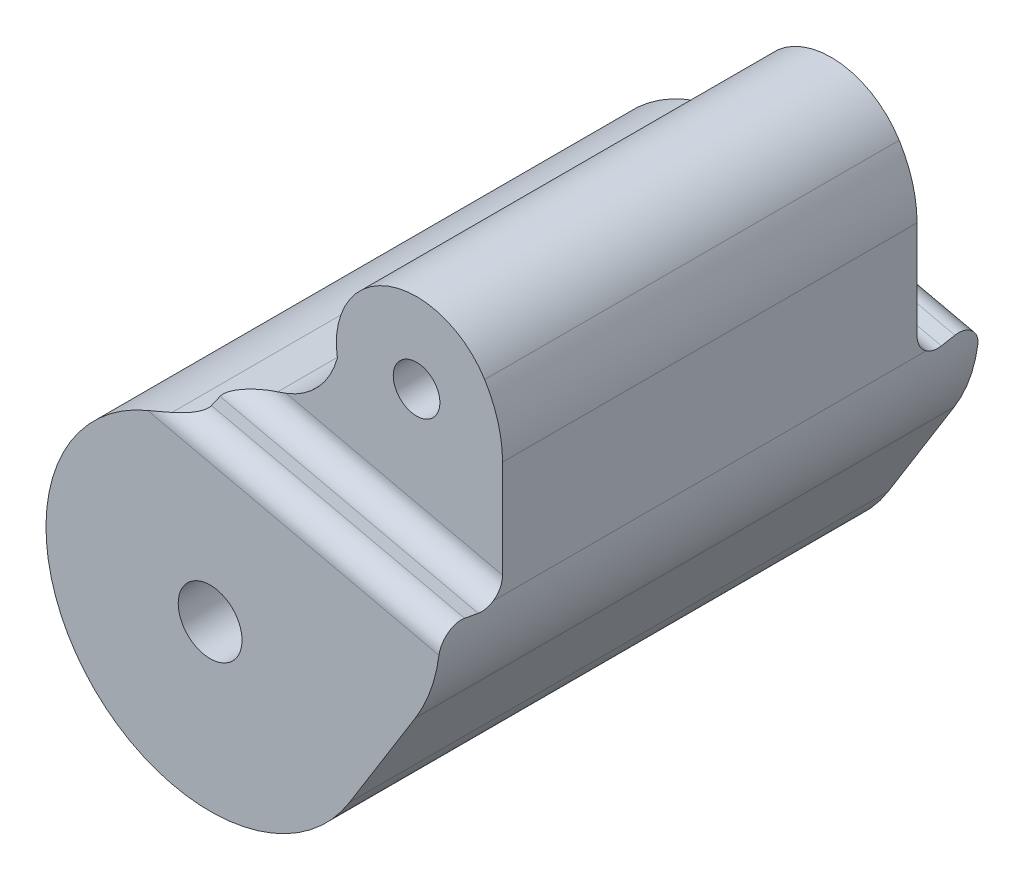
ISO-10303-21;
HEADER;
FILE_DESCRIPTION(('STEP AP214'),'2;1');
FILE_NAME('part.step','',(''),(''),'','','');
FILE_SCHEMA(('AUTOMOTIVE_DESIGN { 1 0 10303 214 1 1 1 1 }'));
ENDSEC;
DATA;
#1=APPLICATION_CONTEXT('core data for automotive mechanical design processes');
#2=APPLICATION_PROTOCOL_DEFINITION('international standard','automotive_design',2000,#1);
#3=PRODUCT_CONTEXT('',#1,'mechanical');
#4=PRODUCT('Part','Part','',(#3));
#5=PRODUCT_RELATED_PRODUCT_CATEGORY('part','',(#4));
#6=PRODUCT_DEFINITION_FORMATION('','',#4);
#7=PRODUCT_DEFINITION_CONTEXT('part definition',#1,'design');
#8=PRODUCT_DEFINITION('design','',#6,#7);
#9=PRODUCT_DEFINITION_SHAPE('','',#8);
#10=(LENGTH_UNIT() NAMED_UNIT(*) SI_UNIT(.MILLI.,.METRE.));
#11=(NAMED_UNIT(*) PLANE_ANGLE_UNIT() SI_UNIT($,.RADIAN.));
#12=(NAMED_UNIT(*) SI_UNIT($,.STERADIAN.) SOLID_ANGLE_UNIT());
#13=UNCERTAINTY_MEASURE_WITH_UNIT(LENGTH_MEASURE(1.E-05),#10,'distance_accuracy_value','');
#14=(GEOMETRIC_REPRESENTATION_CONTEXT(3) GLOBAL_UNCERTAINTY_ASSIGNED_CONTEXT((#13)) GLOBAL_UNIT_ASSIGNED_CONTEXT((#10,
#11,#12)) REPRESENTATION_CONTEXT('',''));
#15=CARTESIAN_POINT('',(0.,0.,0.));
#16=DIRECTION('',(0.,0.,1.));
#17=DIRECTION('',(1.,0.,0.));
#18=AXIS2_PLACEMENT_3D('',#15,#16,#17);
#19=CARTESIAN_POINT('',(-3.8486651097793,6.9931639949653,13.));
#20=DIRECTION('',(0.,0.,-1.));
#21=DIRECTION('',(-1.,0.,0.));
#22=AXIS2_PLACEMENT_3D('',#19,#20,#21);
#23=CYLINDRICAL_SURFACE('',#22,4.02);
#24=CARTESIAN_POINT('',(-3.8486651097793,6.9931639949653,-10.));
#25=DIRECTION('',(0.,0.,-1.));
#26=DIRECTION('',(-1.,0.,0.));
#27=AXIS2_PLACEMENT_3D('',#24,#25,#26);
#28=CIRCLE('',#27,4.02);
#29=CARTESIAN_POINT('',(-2.43806543387227,3.2287771186824,-10.));
#30=VERTEX_POINT('',#29);
#31=CARTESIAN_POINT('',(0.0298023679556354,5.93586081037142,-10.));
#32=VERTEX_POINT('',#31);
#33=EDGE_CURVE('E327',#30,#32,#28,.F.);
#34=ORIENTED_EDGE('',*,*,#33,.F.);
#35=CARTESIAN_POINT('',(-2.43806543387227,3.2287771186824,-10.));
#36=CARTESIAN_POINT('',(-2.47026750834435,3.21670977135976,-10.000001288007));
#37=CARTESIAN_POINT('',(-2.5026214386757,3.20505775667663,-10.000536638408));
#38=CARTESIAN_POINT('',(-2.56755065455409,3.18260981290413,-10.0025585404461));
#39=CARTESIAN_POINT('',(-2.6001256123034,3.17181283040766,-10.0040439005098));
#40=CARTESIAN_POINT('',(-2.66549406462945,3.15107051387799,-10.0078494063288));
#41=CARTESIAN_POINT('',(-2.69828755050749,3.14112514616125,-10.0101695190486));
#42=CARTESIAN_POINT('',(-2.76410428106637,3.12207844976408,-10.0155426969425));
#43=CARTESIAN_POINT('',(-2.79712776215765,3.11297819433025,-10.0185966769065));
#44=CARTESIAN_POINT('',(-2.83023006291763,3.10430940070186,-10.0219635643167));
#45=B_SPLINE_CURVE_WITH_KNOTS('',3,(#35,#36,#37,#38,#39,#40,#41,#42,#43,#44),.UNSPECIFIED.,.F.,
.F.,(4,2,2,2,4),(0.,0.103154592673073,0.206180054192997,0.309201438908278,0.412351915509261),.UNSPECIFIED.);
#46=CARTESIAN_POINT('',(-2.83023006291763,3.10430940070187,-10.0219635643167));
#47=VERTEX_POINT('',#46);
#48=EDGE_CURVE('E280',#30,#47,#45,.T.);
#49=ORIENTED_EDGE('',*,*,#48,.T.);
#50=DIRECTION('',(0.,0.,-1.));
#51=VECTOR('',#50,1.);
#52=CARTESIAN_POINT('',(-2.83023006291763,3.10430940070187,13.));
#53=LINE('',#52,#51);
#54=CARTESIAN_POINT('',(-2.83023006291763,3.10430940070187,10.0219635643167));
#55=VERTEX_POINT('',#54);
#56=EDGE_CURVE('E64',#55,#47,#53,.T.);
#57=ORIENTED_EDGE('',*,*,#56,.F.);
#58=CARTESIAN_POINT('',(-2.83023006291763,3.10430940070187,10.0219635643167));
#59=CARTESIAN_POINT('',(-2.79712776215765,3.11297819433025,10.0185966769065));
#60=CARTESIAN_POINT('',(-2.76410428106637,3.12207844976408,10.0155426969425));
#61=CARTESIAN_POINT('',(-2.69828755050749,3.14112514616125,10.0101695190486));
#62=CARTESIAN_POINT('',(-2.66549406462945,3.15107051387799,10.0078494063288));
#63=CARTESIAN_POINT('',(-2.6001256123034,3.17181283040766,10.0040439005098));
#64=CARTESIAN_POINT('',(-2.56755065455409,3.18260981290413,10.0025585404461));
#65=CARTESIAN_POINT('',(-2.5026214386757,3.20505775667663,10.000536638408));
#66=CARTESIAN_POINT('',(-2.47026750834435,3.21670977135976,10.000001288007));
#67=CARTESIAN_POINT('',(-2.43806543387227,3.2287771186824,10.));
#68=B_SPLINE_CURVE_WITH_KNOTS('',3,(#58,#59,#60,#61,#62,#63,#64,#65,#66,#67),.UNSPECIFIED.,.F.,
.F.,(4,2,2,2,4),(0.,0.103150476600983,0.206171861316264,0.309197322836187,0.41235191550926),.UNSPECIFIED.);
#69=CARTESIAN_POINT('',(-2.43806543387227,3.2287771186824,10.));
#70=VERTEX_POINT('',#69);
#71=EDGE_CURVE('E11',#55,#70,#68,.T.);
#72=ORIENTED_EDGE('',*,*,#71,.T.);
#73=CARTESIAN_POINT('',(-3.8486651097793,6.9931639949653,10.));
#74=DIRECTION('',(0.,0.,1.));
#75=DIRECTION('',(1.,0.,0.));
#76=AXIS2_PLACEMENT_3D('',#73,#74,#75);
#77=CIRCLE('',#76,4.02);
#78=CARTESIAN_POINT('',(0.0298023679556354,5.93586081037142,10.));
#79=VERTEX_POINT('',#78);
#80=EDGE_CURVE('E364',#79,#70,#77,.F.);
#81=ORIENTED_EDGE('',*,*,#80,.F.);
#82=DIRECTION('',(0.,0.,-1.));
#83=VECTOR('',#82,1.);
#84=CARTESIAN_POINT('',(0.0298023679556354,5.93586081037142,13.));
#85=LINE('',#84,#83);
#86=EDGE_CURVE('E195',#79,#32,#85,.T.);
#87=ORIENTED_EDGE('',*,*,#86,.T.);
#88=EDGE_LOOP('',(#34,#49,#57,#72,#81,#87));
#89=FACE_BOUND('',#88,.T.);
#90=ADVANCED_FACE('F43',(#89),#23,.F.);
#91=CARTESIAN_POINT('',(8.,5.57,13.));
#92=DIRECTION('',(-1.,0.,0.));
#93=DIRECTION('',(0.,-1.,0.));
#94=AXIS2_PLACEMENT_3D('',#91,#92,#93);
#95=PLANE('',#94);
#96=DIRECTION('',(0.,-1.,0.));
#97=VECTOR('',#96,1.);
#98=CARTESIAN_POINT('',(8.,5.57,-10.));
#99=LINE('',#98,#97);
#100=CARTESIAN_POINT('',(8.,5.57,-10.));
#101=VERTEX_POINT('',#100);
#102=CARTESIAN_POINT('',(8.,0.851864193884391,-10.));
#103=VERTEX_POINT('',#102);
#104=EDGE_CURVE('E165',#101,#103,#99,.T.);
#105=ORIENTED_EDGE('',*,*,#104,.F.);
#106=DIRECTION('',(0.,0.,-1.));
#107=VECTOR('',#106,1.);
#108=CARTESIAN_POINT('',(8.,5.57,13.));
#109=LINE('',#108,#107);
#110=CARTESIAN_POINT('',(8.,5.57,10.));
#111=VERTEX_POINT('',#110);
#112=EDGE_CURVE('E179',#111,#101,#109,.T.);
#113=ORIENTED_EDGE('',*,*,#112,.F.);
#114=DIRECTION('',(0.,1.,0.));
#115=VECTOR('',#114,1.);
#116=CARTESIAN_POINT('',(8.,5.57,10.));
#117=LINE('',#116,#115);
#118=CARTESIAN_POINT('',(8.,0.85186419388439,10.));
#119=VERTEX_POINT('',#118);
#120=EDGE_CURVE('E369',#119,#111,#117,.T.);
#121=ORIENTED_EDGE('',*,*,#120,.F.);
#122=CARTESIAN_POINT('',(8.,0.85186419388439,11.));
#123=DIRECTION('',(-1.,0.,0.));
#124=DIRECTION('',(0.,-1.,0.));
#125=AXIS2_PLACEMENT_3D('',#122,#123,#124);
#126=ELLIPSE('',#125,1.02559958442035,1.);
#127=CARTESIAN_POINT('',(8.,0.,10.4431322147712));
#128=VERTEX_POINT('',#127);
#129=EDGE_CURVE('E345',#119,#128,#126,.T.);
#130=ORIENTED_EDGE('',*,*,#129,.T.);
#131=DIRECTION('',(0.,0.,-1.));
#132=VECTOR('',#131,1.);
#133=CARTESIAN_POINT('',(8.,0.,13.));
#134=LINE('',#133,#132);
#135=CARTESIAN_POINT('',(8.,0.,-10.4431322147712));
#136=VERTEX_POINT('',#135);
#137=EDGE_CURVE('E72',#128,#136,#134,.T.);
#138=ORIENTED_EDGE('',*,*,#137,.T.);
#139=CARTESIAN_POINT('',(8.,0.851864193884391,-11.));
#140=DIRECTION('',(-1.,0.,0.));
#141=DIRECTION('',(0.,-1.,0.));
#142=AXIS2_PLACEMENT_3D('',#139,#140,#141);
#143=ELLIPSE('',#142,1.02559958442035,1.);
#144=EDGE_CURVE('E181',#136,#103,#143,.T.);
#145=ORIENTED_EDGE('',*,*,#144,.T.);
#146=EDGE_LOOP('',(#105,#113,#121,#130,#138,#145));
#147=FACE_BOUND('',#146,.T.);
#148=ADVANCED_FACE('F177',(#147),#95,.F.);
#149=CARTESIAN_POINT('',(2.28,5.57,13.));
#150=DIRECTION('',(0.,0.,-1.));
#151=DIRECTION('',(-1.,0.,0.));
#152=AXIS2_PLACEMENT_3D('',#149,#150,#151);
#153=CYLINDRICAL_SURFACE('',#152,5.72);
#154=CARTESIAN_POINT('',(2.28,5.57,-10.));
#155=DIRECTION('',(0.,0.,-1.));
#156=DIRECTION('',(-1.,0.,0.));
#157=AXIS2_PLACEMENT_3D('',#154,#155,#156);
#158=CIRCLE('',#157,5.72);
#159=CARTESIAN_POINT('',(7.1383976065202,8.58900193722342,-10.));
#160=VERTEX_POINT('',#159);
#161=EDGE_CURVE('E162',#160,#101,#158,.T.);
#162=ORIENTED_EDGE('',*,*,#161,.F.);
#163=DIRECTION('',(0.,0.,-1.));
#164=VECTOR('',#163,1.);
#165=CARTESIAN_POINT('',(7.1383976065202,8.58900193722342,13.));
#166=LINE('',#165,#164);
#167=CARTESIAN_POINT('',(7.1383976065202,8.58900193722342,10.));
#168=VERTEX_POINT('',#167);
#169=EDGE_CURVE('E189',#168,#160,#166,.T.);
#170=ORIENTED_EDGE('',*,*,#169,.F.);
#171=CARTESIAN_POINT('',(2.28,5.57,10.));
#172=DIRECTION('',(0.,0.,1.));
#173=DIRECTION('',(1.,0.,0.));
#174=AXIS2_PLACEMENT_3D('',#171,#172,#173);
#175=CIRCLE('',#174,5.72);
#176=EDGE_CURVE('E187',#111,#168,#175,.T.);
#177=ORIENTED_EDGE('',*,*,#176,.F.);
#178=ORIENTED_EDGE('',*,*,#112,.T.);
#179=EDGE_LOOP('',(#162,#170,#177,#178));
#180=FACE_BOUND('',#179,.T.);
#181=ADVANCED_FACE('F186',(#180),#153,.T.);
#182=CARTESIAN_POINT('',(3.8513348902207,6.54642545172436,13.));
#183=DIRECTION('',(0.,0.,-1.));
#184=DIRECTION('',(-1.,0.,0.));
#185=AXIS2_PLACEMENT_3D('',#182,#183,#184);
#186=CYLINDRICAL_SURFACE('',#185,3.87);
#187=CARTESIAN_POINT('',(3.8513348902207,6.54642545172436,-10.));
#188=DIRECTION('',(0.,0.,-1.));
#189=DIRECTION('',(-1.,0.,0.));
#190=AXIS2_PLACEMENT_3D('',#187,#188,#189);
#191=CIRCLE('',#190,3.87);
#192=EDGE_CURVE('E168',#32,#160,#191,.T.);
#193=ORIENTED_EDGE('',*,*,#192,.F.);
#194=ORIENTED_EDGE('',*,*,#86,.F.);
#195=CARTESIAN_POINT('',(3.8513348902207,6.54642545172436,10.));
#196=DIRECTION('',(0.,0.,1.));
#197=DIRECTION('',(1.,0.,0.));
#198=AXIS2_PLACEMENT_3D('',#195,#196,#197);
#199=CIRCLE('',#198,3.87);
#200=EDGE_CURVE('E216',#168,#79,#199,.T.);
#201=ORIENTED_EDGE('',*,*,#200,.F.);
#202=ORIENTED_EDGE('',*,*,#169,.T.);
#203=EDGE_LOOP('',(#193,#194,#201,#202));
#204=FACE_BOUND('',#203,.T.);
#205=ADVANCED_FACE('F445',(#204),#186,.T.);
#206=CARTESIAN_POINT('',(3.8513348902207,6.54642545172436,13.));
#207=DIRECTION('',(0.,0.,-1.));
#208=DIRECTION('',(-1.,0.,0.));
#209=AXIS2_PLACEMENT_3D('',#206,#207,#208);
#210=CYLINDRICAL_SURFACE('',#209,1.12500000000001);
#211=CARTESIAN_POINT('',(3.8513348902207,6.54642545172436,10.));
#212=DIRECTION('',(0.,0.,1.));
#213=DIRECTION('',(1.,0.,0.));
#214=AXIS2_PLACEMENT_3D('',#211,#212,#213);
#215=CIRCLE('',#214,1.12500000000001);
#216=CARTESIAN_POINT('',(2.72633489022069,6.54642545172436,10.));
#217=VERTEX_POINT('',#216);
#218=EDGE_CURVE('E212',#217,#217,#215,.T.);
#219=CARTESIAN_POINT('',(3.8513348902207,6.54642545172436,-10.));
#220=DIRECTION('',(0.,0.,-1.));
#221=DIRECTION('',(-1.,0.,0.));
#222=AXIS2_PLACEMENT_3D('',#219,#220,#221);
#223=CIRCLE('',#222,1.12500000000001);
#224=CARTESIAN_POINT('',(2.72633489022069,6.54642545172436,-10.));
#225=VERTEX_POINT('',#224);
#226=EDGE_CURVE('E217',#225,#225,#223,.T.);
#227=CARTESIAN_POINT('',(2.72633489022069,6.54642545172436,10.));
#228=CARTESIAN_POINT('',(2.72633489022069,6.54642545172436,9.79166666666666));
#229=CARTESIAN_POINT('',(2.72633489022069,6.54642545172436,9.58333333333333));
#230=CARTESIAN_POINT('',(2.72633489022069,6.54642545172436,9.16666666666666));
#231=CARTESIAN_POINT('',(2.72633489022069,6.54642545172436,8.95833333333333));
#232=CARTESIAN_POINT('',(2.72633489022069,6.54642545172436,8.54166666666666));
#233=CARTESIAN_POINT('',(2.72633489022069,6.54642545172436,8.33333333333333));
#234=CARTESIAN_POINT('',(2.72633489022069,6.54642545172436,7.91666666666666));
#235=CARTESIAN_POINT('',(2.72633489022069,6.54642545172436,7.70833333333333));
#236=CARTESIAN_POINT('',(2.72633489022069,6.54642545172436,7.29166666666667));
#237=CARTESIAN_POINT('',(2.72633489022069,6.54642545172436,7.08333333333333));
#238=CARTESIAN_POINT('',(2.72633489022069,6.54642545172436,6.66666666666666));
#239=CARTESIAN_POINT('',(2.72633489022069,6.54642545172436,6.45833333333333));
#240=CARTESIAN_POINT('',(2.72633489022069,6.54642545172436,6.04166666666667));
#241=CARTESIAN_POINT('',(2.72633489022069,6.54642545172436,5.83333333333333));
#242=CARTESIAN_POINT('',(2.72633489022069,6.54642545172436,5.41666666666667));
#243=CARTESIAN_POINT('',(2.72633489022069,6.54642545172436,5.20833333333333));
#244=CARTESIAN_POINT('',(2.72633489022069,6.54642545172436,4.79166666666667));
#245=CARTESIAN_POINT('',(2.72633489022069,6.54642545172436,4.58333333333333));
#246=CARTESIAN_POINT('',(2.72633489022069,6.54642545172436,4.16666666666667));
#247=CARTESIAN_POINT('',(2.72633489022069,6.54642545172436,3.95833333333333));
#248=CARTESIAN_POINT('',(2.72633489022069,6.54642545172436,3.54166666666667));
#249=CARTESIAN_POINT('',(2.72633489022069,6.54642545172436,3.33333333333333));
#250=CARTESIAN_POINT('',(2.72633489022069,6.54642545172436,2.91666666666667));
#251=CARTESIAN_POINT('',(2.72633489022069,6.54642545172436,2.70833333333333));
#252=CARTESIAN_POINT('',(2.72633489022069,6.54642545172436,2.29166666666667));
#253=CARTESIAN_POINT('',(2.72633489022069,6.54642545172436,2.08333333333333));
#254=CARTESIAN_POINT('',(2.72633489022069,6.54642545172436,1.66666666666667));
#255=CARTESIAN_POINT('',(2.72633489022069,6.54642545172436,1.45833333333333));
#256=CARTESIAN_POINT('',(2.72633489022069,6.54642545172436,1.04166666666667));
#257=CARTESIAN_POINT('',(2.72633489022069,6.54642545172436,0.833333333333333));
#258=CARTESIAN_POINT('',(2.72633489022069,6.54642545172436,0.416666666666667));
#259=CARTESIAN_POINT('',(2.72633489022069,6.54642545172436,0.208333333333333));
#260=CARTESIAN_POINT('',(2.72633489022069,6.54642545172436,-0.208333333333333));
#261=CARTESIAN_POINT('',(2.72633489022069,6.54642545172436,-0.416666666666667));
#262=CARTESIAN_POINT('',(2.72633489022069,6.54642545172436,-0.833333333333333));
#263=CARTESIAN_POINT('',(2.72633489022069,6.54642545172436,-1.04166666666667));
#264=CARTESIAN_POINT('',(2.72633489022069,6.54642545172436,-1.45833333333333));
#265=CARTESIAN_POINT('',(2.72633489022069,6.54642545172436,-1.66666666666667));
#266=CARTESIAN_POINT('',(2.72633489022069,6.54642545172436,-2.08333333333333));
#267=CARTESIAN_POINT('',(2.72633489022069,6.54642545172436,-2.29166666666667));
#268=CARTESIAN_POINT('',(2.72633489022069,6.54642545172436,-2.70833333333333));
#269=CARTESIAN_POINT('',(2.72633489022069,6.54642545172436,-2.91666666666666));
#270=CARTESIAN_POINT('',(2.72633489022069,6.54642545172436,-3.33333333333333));
#271=CARTESIAN_POINT('',(2.72633489022069,6.54642545172436,-3.54166666666666));
#272=CARTESIAN_POINT('',(2.72633489022069,6.54642545172436,-3.95833333333333));
#273=CARTESIAN_POINT('',(2.72633489022069,6.54642545172436,-4.16666666666667));
#274=CARTESIAN_POINT('',(2.72633489022069,6.54642545172436,-4.58333333333333));
#275=CARTESIAN_POINT('',(2.72633489022069,6.54642545172436,-4.79166666666667));
#276=CARTESIAN_POINT('',(2.72633489022069,6.54642545172436,-5.20833333333333));
#277=CARTESIAN_POINT('',(2.72633489022069,6.54642545172436,-5.41666666666667));
#278=CARTESIAN_POINT('',(2.72633489022069,6.54642545172436,-5.83333333333333));
#279=CARTESIAN_POINT('',(2.72633489022069,6.54642545172436,-6.04166666666667));
#280=CARTESIAN_POINT('',(2.72633489022069,6.54642545172436,-6.45833333333333));
#281=CARTESIAN_POINT('',(2.72633489022069,6.54642545172436,-6.66666666666666));
#282=CARTESIAN_POINT('',(2.72633489022069,6.54642545172436,-7.08333333333333));
#283=CARTESIAN_POINT('',(2.72633489022069,6.54642545172436,-7.29166666666666));
#284=CARTESIAN_POINT('',(2.72633489022069,6.54642545172436,-7.70833333333333));
#285=CARTESIAN_POINT('',(2.72633489022069,6.54642545172436,-7.91666666666667));
#286=CARTESIAN_POINT('',(2.72633489022069,6.54642545172436,-8.33333333333333));
#287=CARTESIAN_POINT('',(2.72633489022069,6.54642545172436,-8.54166666666666));
#288=CARTESIAN_POINT('',(2.72633489022069,6.54642545172436,-8.95833333333333));
#289=CARTESIAN_POINT('',(2.72633489022069,6.54642545172436,-9.16666666666666));
#290=CARTESIAN_POINT('',(2.72633489022069,6.54642545172436,-9.58333333333333));
#291=CARTESIAN_POINT('',(2.72633489022069,6.54642545172436,-9.79166666666666));
#292=CARTESIAN_POINT('',(2.72633489022069,6.54642545172436,-10.));
#293=B_SPLINE_CURVE_WITH_KNOTS('',3,(#227,#228,#229,#230,#231,#232,#233,#234,#235,#236,#237,
#238,#239,#240,#241,#242,#243,#244,#245,#246,#247,#248,#249,#250,#251,#252,#253,#254,#255,#256,
#257,#258,#259,#260,#261,#262,#263,#264,#265,#266,#267,#268,#269,#270,#271,#272,#273,#274,#275,
#276,#277,#278,#279,#280,#281,#282,#283,#284,#285,#286,#287,#288,#289,#290,#291,#292),
.UNSPECIFIED.,.F.,.F.,(4,2,2,2,2,2,2,2,2,2,2,2,2,2,2,2,2,2,2,2,2,2,2,2,2,2,2,2,2,2,2,2,4),(0.,
0.624999999999999,1.25,1.875,2.5,3.125,3.75,4.375,5.,5.625,6.25,6.875,7.5,8.125,8.75,9.375,10.,
10.625,11.25,11.875,12.5,13.125,13.75,14.375,15.,15.625,16.25,16.875,17.5,18.125,18.75,19.375,
20.),.UNSPECIFIED.);
#294=EDGE_CURVE('BSEAM471',#217,#225,#293,.T.);
#295=ORIENTED_EDGE('',*,*,#218,.T.);
#296=ORIENTED_EDGE('',*,*,#226,.T.);
#297=ORIENTED_EDGE('',*,*,#294,.T.);
#298=ORIENTED_EDGE('',*,*,#294,.F.);
#299=EDGE_LOOP('',(#295,#297,#296,#298));
#300=FACE_BOUND('',#299,.T.);
#301=ADVANCED_FACE('F471',(#300),#210,.F.);
#302=CARTESIAN_POINT('',(-3.8486651097793,6.9931639949653,-13.));
#303=DIRECTION('',(0.,0.,-1.));
#304=DIRECTION('',(-1.,0.,0.));
#305=AXIS2_PLACEMENT_3D('',#302,#303,#304);
#306=PLANE('',#305);
#307=CARTESIAN_POINT('',(-3.10886455277903,-5.15575030354206,-13.));
#308=DIRECTION('',(0.,0.,1.));
#309=DIRECTION('',(1.,0.,0.));
#310=AXIS2_PLACEMENT_3D('',#307,#308,#309);
#311=CIRCLE('',#310,1.54);
#312=CARTESIAN_POINT('',(-4.64886455277903,-5.15575030354206,-13.));
#313=VERTEX_POINT('',#312);
#314=EDGE_CURVE('E379',#313,#313,#311,.T.);
#315=ORIENTED_EDGE('',*,*,#314,.T.);
#316=EDGE_LOOP('',(#315));
#317=FACE_BOUND('',#316,.T.);
#318=CARTESIAN_POINT('',(-3.10886455277903,-5.15575030354206,-13.));
#319=DIRECTION('',(0.,0.,1.));
#320=DIRECTION('',(-1.,0.,0.));
#321=AXIS2_PLACEMENT_3D('',#318,#319,#320);
#322=CIRCLE('',#321,7.92);
#323=CARTESIAN_POINT('',(-6.12672761900291,2.1667426130487,-13.));
#324=VERTEX_POINT('',#323);
#325=CARTESIAN_POINT('',(3.61857479888122,-9.33521914177175,-13.));
#326=VERTEX_POINT('',#325);
#327=EDGE_CURVE('E384',#324,#326,#322,.T.);
#328=ORIENTED_EDGE('',*,*,#327,.F.);
#329=DIRECTION('',(-0.975039396652237,0.222031923326446,0.));
#330=VECTOR('',#329,1.);
#331=CARTESIAN_POINT('',(-5.00584078384651,1.91149891654211,-13.));
#332=LINE('',#331,#330);
#333=CARTESIAN_POINT('',(7.93278784449341,-1.03483187729098,-13.));
#334=VERTEX_POINT('',#333);
#335=EDGE_CURVE('E220',#324,#334,#332,.F.);
#336=ORIENTED_EDGE('',*,*,#335,.T.);
#337=CARTESIAN_POINT('',(0.,0.,-13.));
#338=DIRECTION('',(0.,0.,1.));
#339=DIRECTION('',(-1.,0.,0.));
#340=AXIS2_PLACEMENT_3D('',#337,#338,#339);
#341=CIRCLE('',#340,8.);
#342=CARTESIAN_POINT('',(6.79539328450531,-4.22168569518151,-13.));
#343=VERTEX_POINT('',#342);
#344=EDGE_CURVE('E392',#343,#334,#341,.T.);
#345=ORIENTED_EDGE('',*,*,#344,.F.);
#346=DIRECTION('',(0.527710711897689,0.849424160563163,0.));
#347=VECTOR('',#346,1.);
#348=CARTESIAN_POINT('',(6.79539328450531,-4.22168569518151,-13.));
#349=LINE('',#348,#347);
#350=EDGE_CURVE('E401',#326,#343,#349,.T.);
#351=ORIENTED_EDGE('',*,*,#350,.F.);
#352=EDGE_LOOP('',(#328,#336,#345,#351));
#353=FACE_BOUND('',#352,.T.);
#354=ADVANCED_FACE('F294',(#317,#353),#306,.T.);
#355=CARTESIAN_POINT('',(-5.11533360032743,2.50587367321576,13.));
#356=DIRECTION('',(0.253342051458129,-0.967376764742149,0.));
#357=DIRECTION('',(0.967376764742149,0.253342051458129,0.));
#358=AXIS2_PLACEMENT_3D('',#355,#356,#357);
#359=PLANE('',#358);
#360=DIRECTION('',(0.,0.,-1.));
#361=VECTOR('',#360,1.);
#362=CARTESIAN_POINT('',(-5.11533360032743,2.50587367321576,13.));
#363=LINE('',#362,#361);
#364=CARTESIAN_POINT('',(-5.11533360032743,2.50587367321576,12.8316982476695));
#365=VERTEX_POINT('',#364);
#366=CARTESIAN_POINT('',(-5.11533360032743,2.50587367321576,-12.8316982476695));
#367=VERTEX_POINT('',#366);
#368=EDGE_CURVE('E206',#365,#367,#363,.T.);
#369=ORIENTED_EDGE('',*,*,#368,.F.);
#370=CARTESIAN_POINT('',(-6.27840511627298,2.20128198300631,12.));
#371=DIRECTION('',(0.253342051458129,-0.967376764742149,0.));
#372=DIRECTION('',(0.967376764742149,0.253342051458129,0.));
#373=AXIS2_PLACEMENT_3D('',#370,#371,#372);
#374=ELLIPSE('',#373,2.16540673899456,1.);
#375=CARTESIAN_POINT('',(-4.21546512533732,2.74153627521887,11.8263518223331));
#376=VERTEX_POINT('',#375);
#377=EDGE_CURVE('E315',#365,#376,#374,.F.);
#378=ORIENTED_EDGE('',*,*,#377,.T.);
#379=DIRECTION('',(-0.34506595060457,-0.0903678060097014,-0.934217934622515));
#380=VECTOR('',#379,1.);
#381=CARTESIAN_POINT('',(-3.95161634908844,2.81063447220464,12.5406855848154));
#382=LINE('',#381,#380);
#383=CARTESIAN_POINT('',(-4.45654998922488,2.67839961924486,11.1736481776669));
#384=VERTEX_POINT('',#383);
#385=EDGE_CURVE('E361',#376,#384,#382,.T.);
#386=ORIENTED_EDGE('',*,*,#385,.T.);
#387=CARTESIAN_POINT('',(-2.39360999828923,3.21865391145743,11.));
#388=DIRECTION('',(0.253342051458129,-0.967376764742149,0.));
#389=DIRECTION('',(0.967376764742149,0.253342051458129,0.));
#390=AXIS2_PLACEMENT_3D('',#387,#388,#389);
#391=ELLIPSE('',#390,2.16540673899456,1.);
#392=EDGE_CURVE('E58',#384,#55,#391,.T.);
#393=ORIENTED_EDGE('',*,*,#392,.T.);
#394=ORIENTED_EDGE('',*,*,#56,.T.);
#395=CARTESIAN_POINT('',(-2.39360999828923,3.21865391145743,-11.));
#396=DIRECTION('',(0.253342051458129,-0.967376764742149,0.));
#397=DIRECTION('',(0.967376764742149,0.253342051458129,0.));
#398=AXIS2_PLACEMENT_3D('',#395,#396,#397);
#399=ELLIPSE('',#398,2.16540673899456,1.);
#400=CARTESIAN_POINT('',(-4.45654998922488,2.67839961924486,-11.1736481776669));
#401=VERTEX_POINT('',#400);
#402=EDGE_CURVE('E287',#47,#401,#399,.T.);
#403=ORIENTED_EDGE('',*,*,#402,.T.);
#404=DIRECTION('',(0.34506595060457,0.0903678060097014,-0.934217934622515));
#405=VECTOR('',#404,1.);
#406=CARTESIAN_POINT('',(-12.3331531408297,0.615630619949107,10.1511562988139));
#407=LINE('',#406,#405);
#408=CARTESIAN_POINT('',(-4.21546512533732,2.74153627521887,-11.8263518223331));
#409=VERTEX_POINT('',#408);
#410=EDGE_CURVE('E183',#409,#401,#407,.F.);
#411=ORIENTED_EDGE('',*,*,#410,.F.);
#412=CARTESIAN_POINT('',(-6.27840511627298,2.20128198300631,-12.));
#413=DIRECTION('',(0.253342051458129,-0.967376764742149,0.));
#414=DIRECTION('',(-0.967376764742149,-0.253342051458129,0.));
#415=AXIS2_PLACEMENT_3D('',#412,#413,#414);
#416=ELLIPSE('',#415,2.16540673899456,1.);
#417=EDGE_CURVE('E419',#409,#367,#416,.F.);
#418=ORIENTED_EDGE('',*,*,#417,.T.);
#419=EDGE_LOOP('',(#369,#378,#386,#393,#394,#403,#411,#418));
#420=FACE_BOUND('',#419,.T.);
#421=ADVANCED_FACE('F245',(#420),#359,.F.);
#422=CARTESIAN_POINT('',(0.,0.,13.));
#423=DIRECTION('',(0.,0.,-1.));
#424=DIRECTION('',(-1.,0.,0.));
#425=AXIS2_PLACEMENT_3D('',#422,#423,#424);
#426=CYLINDRICAL_SURFACE('',#425,8.);
#427=ORIENTED_EDGE('',*,*,#137,.F.);
#428=CARTESIAN_POINT('',(8.,0.,10.4431322147712));
#429=CARTESIAN_POINT('',(7.99999972168051,-0.0156621425541701,10.4659102767497));
#430=CARTESIAN_POINT('',(7.99995406640041,-0.0303634518808904,10.489333177973));
#431=CARTESIAN_POINT('',(7.99980329324114,-0.057752575958232,10.5373285943015));
#432=CARTESIAN_POINT('',(7.99969817362192,-0.0704403317739717,10.5619011430286));
#433=CARTESIAN_POINT('',(7.99934056316604,-0.10534424368915,10.6371311311712));
#434=CARTESIAN_POINT('',(7.99904582083767,-0.124401017414187,10.6893008734877));
#435=CARTESIAN_POINT('',(7.99854121839214,-0.153463922503186,10.7961147739615));
#436=CARTESIAN_POINT('',(7.99833143226417,-0.163462174047052,10.8507610431));
#437=CARTESIAN_POINT('',(7.99810768839357,-0.174081078785524,10.960884401148));
#438=CARTESIAN_POINT('',(7.99809330474073,-0.17472212769288,11.016359419162));
#439=CARTESIAN_POINT('',(7.99820516899084,-0.169449405365699,11.0885684222151));
#440=CARTESIAN_POINT('',(7.9982414132491,-0.167744615392987,11.10567955388));
#441=CARTESIAN_POINT('',(7.99833061059263,-0.163440365491603,11.1397672841778));
#442=CARTESIAN_POINT('',(7.99838354283989,-0.16084202096443,11.1567440236685));
#443=CARTESIAN_POINT('',(7.99844355003619,-0.157799800015032,11.1736481776669));
#444=B_SPLINE_CURVE_WITH_KNOTS('',3,(#428,#429,#430,#431,#432,#433,#434,#435,#436,#437,#438,
#439,#440,#441,#442,#443),.UNSPECIFIED.,.F.,.F.,(4,2,2,2,2,2,2,4),(0.,0.0828788864387145,
0.165760198219911,0.331522962169218,0.497429781642022,0.662974923110118,0.71454616162651,
0.766053257349152),.UNSPECIFIED.);
#445=CARTESIAN_POINT('',(7.99844355003617,-0.157799800015026,11.1736481776669));
#446=VERTEX_POINT('',#445);
#447=EDGE_CURVE('E349',#128,#446,#444,.T.);
#448=ORIENTED_EDGE('',*,*,#447,.T.);
#449=CARTESIAN_POINT('',(0.,0.,1.97455240277872));
#450=DIRECTION('',(-0.218658759508096,-0.960226357315469,0.173648177666931));
#451=DIRECTION('',(-0.038555438869521,-0.169313814382125,-0.984807753012208));
#452=AXIS2_PLACEMENT_3D('',#449,#450,#451);
#453=ELLIPSE('',#452,46.070163865149,8.);
#454=CARTESIAN_POINT('',(7.99989951955938,-0.040095847085646,11.8263518223331));
#455=VERTEX_POINT('',#454);
#456=EDGE_CURVE('E368',#446,#455,#453,.T.);
#457=ORIENTED_EDGE('',*,*,#456,.T.);
#458=CARTESIAN_POINT('',(7.99989951955938,-0.040095847085646,11.8263518223331));
#459=CARTESIAN_POINT('',(7.99992329552834,-0.0351980482633242,11.8534645492961));
#460=CARTESIAN_POINT('',(7.99993846808891,-0.0314482211401848,11.880771607707));
#461=CARTESIAN_POINT('',(7.99995743695009,-0.0262668565151716,11.9356031175517));
#462=CARTESIAN_POINT('',(7.99996123390595,-0.0248351854905127,11.9631275563729));
#463=CARTESIAN_POINT('',(7.99996430377252,-0.0240514311620167,12.0456527658533));
#464=CARTESIAN_POINT('',(7.99995530928727,-0.0281887387629302,12.1007270288598));
#465=CARTESIAN_POINT('',(7.99987428180723,-0.0456560530779227,12.2093887686099));
#466=CARTESIAN_POINT('',(7.99980222340114,-0.0589897649803433,12.2629756370337));
#467=CARTESIAN_POINT('',(7.99946255447027,-0.0943939619751887,12.367179735353));
#468=CARTESIAN_POINT('',(7.99919495034425,-0.116464161177167,12.4177970623607));
#469=CARTESIAN_POINT('',(7.99826131609839,-0.168830413205967,12.5150711530517));
#470=CARTESIAN_POINT('',(7.99759225358803,-0.199188104061099,12.5616946550616));
#471=CARTESIAN_POINT('',(7.99561107432591,-0.267124356633127,12.6493349468758));
#472=CARTESIAN_POINT('',(7.99429883869708,-0.304704252442392,12.6903506984117));
#473=CARTESIAN_POINT('',(7.99074839470802,-0.386863208889362,12.7665246214913));
#474=CARTESIAN_POINT('',(7.98849112358877,-0.431573897970265,12.8015399869614));
#475=CARTESIAN_POINT('',(7.9828209640573,-0.526126574920458,12.8637030114928));
#476=CARTESIAN_POINT('',(7.97940758955069,-0.575970715051911,12.8908473521833));
#477=CARTESIAN_POINT('',(7.97122305683285,-0.679968129496361,12.9367661710851));
#478=CARTESIAN_POINT('',(7.96643658910215,-0.734164728426234,12.9554397758963));
#479=CARTESIAN_POINT('',(7.95547061695183,-0.844718106413119,12.9833437596057));
#480=CARTESIAN_POINT('',(7.94929382514839,-0.901070503993211,12.9925923357082));
#481=CARTESIAN_POINT('',(7.93937525245113,-0.983368262413646,12.9990029795919));
#482=CARTESIAN_POINT('',(7.93614546783531,-1.00911550668235,13.0000071839242));
#483=CARTESIAN_POINT('',(7.93278784449341,-1.03483187729098,13.));
#484=B_SPLINE_CURVE_WITH_KNOTS('',3,(#458,#459,#460,#461,#462,#463,#464,#465,#466,#467,#468,
#469,#470,#471,#472,#473,#474,#475,#476,#477,#478,#479,#480,#481,#482,#483),.UNSPECIFIED.,.F.,
.F.,(4,2,2,2,2,2,2,2,2,2,2,2,4),(0.,0.0826044096121802,0.165204061148216,0.33003746856786,
0.494937325421059,0.659831786581994,0.825987729070686,0.992174393590669,1.16188839885812,
1.33167385072115,1.50343127482427,1.6748564494786,1.75267903348873),.UNSPECIFIED.);
#485=CARTESIAN_POINT('',(7.93278784449341,-1.03483187729098,13.));
#486=VERTEX_POINT('',#485);
#487=EDGE_CURVE('E254',#455,#486,#484,.T.);
#488=ORIENTED_EDGE('',*,*,#487,.T.);
#489=CARTESIAN_POINT('',(0.,0.,13.));
#490=DIRECTION('',(0.,0.,1.));
#491=DIRECTION('',(-1.,0.,0.));
#492=AXIS2_PLACEMENT_3D('',#489,#490,#491);
#493=CIRCLE('',#492,8.);
#494=CARTESIAN_POINT('',(6.79539328450531,-4.22168569518151,13.));
#495=VERTEX_POINT('',#494);
#496=EDGE_CURVE('E395',#495,#486,#493,.T.);
#497=ORIENTED_EDGE('',*,*,#496,.F.);
#498=DIRECTION('',(0.,0.,-1.));
#499=VECTOR('',#498,1.);
#500=CARTESIAN_POINT('',(6.79539328450531,-4.22168569518151,13.));
#501=LINE('',#500,#499);
#502=EDGE_CURVE('E193',#495,#343,#501,.T.);
#503=ORIENTED_EDGE('',*,*,#502,.T.);
#504=ORIENTED_EDGE('',*,*,#344,.T.);
#505=CARTESIAN_POINT('',(7.93278784449341,-1.03483187729098,-13.));
#506=CARTESIAN_POINT('',(7.9401689931605,-0.978427555105153,-13.0000454427213));
#507=CARTESIAN_POINT('',(7.94690003178813,-0.921965694183332,-12.9951919455525));
#508=CARTESIAN_POINT('',(7.95902135231775,-0.810565734697671,-12.9760958138571));
#509=CARTESIAN_POINT('',(7.96441310880377,-0.755626019981344,-12.9618635692334));
#510=CARTESIAN_POINT('',(7.97383239056238,-0.648770793365695,-12.9244146770488));
#511=CARTESIAN_POINT('',(7.97785974546923,-0.596855659799731,-12.9011969082871));
#512=CARTESIAN_POINT('',(7.98466972194368,-0.497517682566427,-12.8464573678545));
#513=CARTESIAN_POINT('',(7.98745232928136,-0.450094890260318,-12.8149355012579));
#514=CARTESIAN_POINT('',(7.99198779759918,-0.360764788385756,-12.7441765247274));
#515=CARTESIAN_POINT('',(7.99373285187852,-0.318901088856349,-12.7048838166796));
#516=CARTESIAN_POINT('',(7.99641970808148,-0.242366325059432,-12.6197971857949));
#517=CARTESIAN_POINT('',(7.99736151035766,-0.207695257634995,-12.5740032658114));
#518=CARTESIAN_POINT('',(7.99871056506102,-0.146815878781074,-12.4774361554271));
#519=CARTESIAN_POINT('',(7.99912070357195,-0.120562463414226,-12.4266914701955));
#520=CARTESIAN_POINT('',(7.99965779552395,-0.0771406980949702,-12.3214245802575));
#521=CARTESIAN_POINT('',(7.99978466920903,-0.0599749078900342,-12.2669013161094));
#522=CARTESIAN_POINT('',(7.999929897115,-0.0355963348526509,-12.1568152830746));
#523=CARTESIAN_POINT('',(7.99995035191357,-0.0281930659378237,-12.1012945221306));
#524=CARTESIAN_POINT('',(7.99996776193966,-0.0229964543173784,-11.9898915140317));
#525=CARTESIAN_POINT('',(7.99996476831633,-0.0251821900880403,-11.9340103192191));
#526=CARTESIAN_POINT('',(7.99992640477613,-0.0342796070136436,-11.8612314834395));
#527=CARTESIAN_POINT('',(7.99991451315988,-0.0369504427941375,-11.8437441194805));
#528=CARTESIAN_POINT('',(7.99989951955938,-0.0400958470856452,-11.8263518223331));
#529=B_SPLINE_CURVE_WITH_KNOTS('',3,(#505,#506,#507,#508,#509,#510,#511,#512,#513,#514,#515,
#516,#517,#518,#519,#520,#521,#522,#523,#524,#525,#526,#527,#528),.UNSPECIFIED.,.F.,.F.,(4,2,2,
2,2,2,2,2,2,2,2,4),(0.,0.170406193818445,0.340623926000084,0.510862904557364,0.681103829233162,
0.852609973274042,1.02411604203881,1.19468715379841,1.3653062854718,1.53254446807847,
1.69941794803262,1.75245962939244),.UNSPECIFIED.);
#530=CARTESIAN_POINT('',(7.99989951955939,-0.0400958470856466,-11.8263518223331));
#531=VERTEX_POINT('',#530);
#532=EDGE_CURVE('E224',#334,#531,#529,.T.);
#533=ORIENTED_EDGE('',*,*,#532,.T.);
#534=CARTESIAN_POINT('',(0.,0.,-1.97455240277872));
#535=DIRECTION('',(-0.218658759508096,-0.960226357315469,-0.173648177666931));
#536=DIRECTION('',(0.038555438869521,0.169313814382125,-0.984807753012208));
#537=AXIS2_PLACEMENT_3D('',#534,#535,#536);
#538=ELLIPSE('',#537,46.070163865149,8.);
#539=CARTESIAN_POINT('',(7.99844355003617,-0.157799800015027,-11.1736481776669));
#540=VERTEX_POINT('',#539);
#541=EDGE_CURVE('E211',#540,#531,#538,.F.);
#542=ORIENTED_EDGE('',*,*,#541,.F.);
#543=CARTESIAN_POINT('',(7.99844355003617,-0.157799800015027,-11.1736481776669));
#544=CARTESIAN_POINT('',(7.99834642822043,-0.162683493310572,-11.1465197300967));
#545=CARTESIAN_POINT('',(7.99826910206276,-0.166420541488449,-11.1191984713));
#546=CARTESIAN_POINT('',(7.9981603241865,-0.171581844564649,-11.0643386797641));
#547=CARTESIAN_POINT('',(7.99812887187898,-0.173006129154095,-11.0368001498189));
#548=CARTESIAN_POINT('',(7.99811275117419,-0.173780531112045,-10.9541311351583));
#549=CARTESIAN_POINT('',(7.99820623535937,-0.169635950150044,-10.898926280213));
#550=CARTESIAN_POINT('',(7.99855792281407,-0.152134875223898,-10.7899987921446));
#551=CARTESIAN_POINT('',(7.99881623685332,-0.138772185973113,-10.7362771811458));
#552=CARTESIAN_POINT('',(7.99935337663969,-0.103238204933836,-10.6319029289501));
#553=CARTESIAN_POINT('',(7.99963216044869,-0.0810845350310431,-10.5812443804085));
#554=CARTESIAN_POINT('',(7.99986883640012,-0.0465520914365344,-10.5174077712474));
#555=CARTESIAN_POINT('',(7.99991597025678,-0.0377893908956358,-10.5021970561527));
#556=CARTESIAN_POINT('',(7.99998153943834,-0.0194791384261365,-10.4722831806424));
#557=CARTESIAN_POINT('',(8.00000001271021,-0.00993264192758992,-10.4575793743529));
#558=CARTESIAN_POINT('',(8.00000000000001,0.,-10.4431322147712));
#559=B_SPLINE_CURVE_WITH_KNOTS('',3,(#543,#544,#545,#546,#547,#548,#549,#550,#551,#552,#553,
#554,#555,#556,#557,#558),.UNSPECIFIED.,.F.,.F.,(4,2,2,2,2,2,2,4),(0.,0.0826427372645089,
0.165284413557987,0.330504739749583,0.495836215187299,0.66083793754287,0.713483442193666,
0.766059183866483),.UNSPECIFIED.);
#560=EDGE_CURVE('E262',#540,#136,#559,.T.);
#561=ORIENTED_EDGE('',*,*,#560,.T.);
#562=EDGE_LOOP('',(#427,#448,#457,#488,#497,#503,#504,#533,#542,#561));
#563=FACE_BOUND('',#562,.T.);
#564=ADVANCED_FACE('F239',(#563),#426,.T.);
#565=CARTESIAN_POINT('',(-3.8486651097793,6.9931639949653,13.));
#566=DIRECTION('',(0.,0.,-1.));
#567=DIRECTION('',(-1.,0.,0.));
#568=AXIS2_PLACEMENT_3D('',#565,#566,#567);
#569=PLANE('',#568);
#570=ORIENTED_EDGE('',*,*,#496,.T.);
#571=DIRECTION('',(0.975039396652237,-0.222031923326446,0.));
#572=VECTOR('',#571,1.);
#573=CARTESIAN_POINT('',(-5.00584078384651,1.91149891654211,13.));
#574=LINE('',#573,#572);
#575=CARTESIAN_POINT('',(-6.12672761900291,2.1667426130487,13.));
#576=VERTEX_POINT('',#575);
#577=EDGE_CURVE('E316',#486,#576,#574,.F.);
#578=ORIENTED_EDGE('',*,*,#577,.T.);
#579=CARTESIAN_POINT('',(-3.10886455277903,-5.15575030354206,13.));
#580=DIRECTION('',(0.,0.,1.));
#581=DIRECTION('',(-1.,0.,0.));
#582=AXIS2_PLACEMENT_3D('',#579,#580,#581);
#583=CIRCLE('',#582,7.92);
#584=CARTESIAN_POINT('',(3.61857479888122,-9.33521914177175,13.));
#585=VERTEX_POINT('',#584);
#586=EDGE_CURVE('E388',#576,#585,#583,.T.);
#587=ORIENTED_EDGE('',*,*,#586,.T.);
#588=DIRECTION('',(0.527710711897689,0.849424160563163,0.));
#589=VECTOR('',#588,1.);
#590=CARTESIAN_POINT('',(6.79539328450531,-4.22168569518151,13.));
#591=LINE('',#590,#589);
#592=EDGE_CURVE('E391',#585,#495,#591,.T.);
#593=ORIENTED_EDGE('',*,*,#592,.T.);
#594=EDGE_LOOP('',(#570,#578,#587,#593));
#595=FACE_BOUND('',#594,.T.);
#596=CARTESIAN_POINT('',(-3.10886455277903,-5.15575030354206,13.));
#597=DIRECTION('',(0.,0.,1.));
#598=DIRECTION('',(1.,0.,0.));
#599=AXIS2_PLACEMENT_3D('',#596,#597,#598);
#600=CIRCLE('',#599,1.54);
#601=CARTESIAN_POINT('',(-4.64886455277903,-5.15575030354206,13.));
#602=VERTEX_POINT('',#601);
#603=EDGE_CURVE('E380',#602,#602,#600,.T.);
#604=ORIENTED_EDGE('',*,*,#603,.F.);
#605=EDGE_LOOP('',(#604));
#606=FACE_BOUND('',#605,.T.);
#607=ADVANCED_FACE('F244',(#595,#606),#569,.F.);
#608=CARTESIAN_POINT('',(-3.10886455277903,-5.15575030354206,13.));
#609=DIRECTION('',(0.,0.,-1.));
#610=DIRECTION('',(-1.,0.,0.));
#611=AXIS2_PLACEMENT_3D('',#608,#609,#610);
#612=CYLINDRICAL_SURFACE('',#611,7.92);
#613=ORIENTED_EDGE('',*,*,#586,.F.);
#614=CARTESIAN_POINT('',(-6.12672761900291,2.1667426130487,13.));
#615=CARTESIAN_POINT('',(-6.08478978540106,2.1840273616801,12.9999966668906));
#616=CARTESIAN_POINT('',(-6.04271244547285,2.20094672918563,12.9989735310774));
#617=CARTESIAN_POINT('',(-5.95836138581039,2.23402762503662,12.9950117459354));
#618=CARTESIAN_POINT('',(-5.91608771601001,2.25018933560065,12.9920735597412));
#619=CARTESIAN_POINT('',(-5.78962498026411,2.29730126027354,12.980622341933));
#620=CARTESIAN_POINT('',(-5.70523830508842,2.32710712118646,12.969469180152));
#621=CARTESIAN_POINT('',(-5.5365191790441,2.38353389170989,12.940791707443));
#622=CARTESIAN_POINT('',(-5.45218672069464,2.41015543889551,12.9232686747618));
#623=CARTESIAN_POINT('',(-5.32581533261954,2.44776729546343,12.8924224270053));
#624=CARTESIAN_POINT('',(-5.28357293805473,2.45995433777085,12.881335647111));
#625=CARTESIAN_POINT('',(-5.19928824584069,2.48351959968175,12.8576498405984));
#626=CARTESIAN_POINT('',(-5.15724594305798,2.49489784014099,12.8450508529965));
#627=CARTESIAN_POINT('',(-5.11533360032743,2.50587367321576,12.8316982476695));
#628=B_SPLINE_CURVE_WITH_KNOTS('',3,(#614,#615,#616,#617,#618,#619,#620,#621,#622,#623,#624,
#625,#626,#627),.UNSPECIFIED.,.F.,.F.,(4,2,2,2,2,2,4),(0.,0.136050137120312,0.272067384162012,
0.542304789509327,0.812487996025784,0.948484264313033,1.08447702452773),.UNSPECIFIED.);
#629=EDGE_CURVE('E308',#576,#365,#628,.T.);
#630=ORIENTED_EDGE('',*,*,#629,.T.);
#631=ORIENTED_EDGE('',*,*,#368,.T.);
#632=CARTESIAN_POINT('',(-5.11533360032743,2.50587367321576,-12.8316982476695));
#633=CARTESIAN_POINT('',(-5.15724594305798,2.49489784014099,-12.8450508529965));
#634=CARTESIAN_POINT('',(-5.19928824584068,2.48351959968175,-12.8576498405984));
#635=CARTESIAN_POINT('',(-5.28357293805473,2.45995433777085,-12.881335647111));
#636=CARTESIAN_POINT('',(-5.32581533261954,2.44776729546343,-12.8924224270053));
#637=CARTESIAN_POINT('',(-5.45218672069464,2.41015543889551,-12.9232686747618));
#638=CARTESIAN_POINT('',(-5.5365191790441,2.38353389170989,-12.940791707443));
#639=CARTESIAN_POINT('',(-5.70523830508842,2.32710712118646,-12.969469180152));
#640=CARTESIAN_POINT('',(-5.78962498026411,2.29730126027354,-12.980622341933));
#641=CARTESIAN_POINT('',(-5.91608771601001,2.25018933560065,-12.9920735597412));
#642=CARTESIAN_POINT('',(-5.95836138581039,2.23402762503662,-12.9950117459354));
#643=CARTESIAN_POINT('',(-6.04271244547285,2.20094672918563,-12.9989735310774));
#644=CARTESIAN_POINT('',(-6.08478978540106,2.1840273616801,-12.9999966668906));
#645=CARTESIAN_POINT('',(-6.12672761900291,2.1667426130487,-13.));
#646=B_SPLINE_CURVE_WITH_KNOTS('',3,(#632,#633,#634,#635,#636,#637,#638,#639,#640,#641,#642,
#643,#644,#645),.UNSPECIFIED.,.F.,.F.,(4,2,2,2,2,2,4),(0.,0.135992760214692,0.271989028501942,
0.5421722350184,0.812409640365716,0.948426887407416,1.08447702452773),.UNSPECIFIED.);
#647=EDGE_CURVE('E302',#367,#324,#646,.T.);
#648=ORIENTED_EDGE('',*,*,#647,.T.);
#649=ORIENTED_EDGE('',*,*,#327,.T.);
#650=DIRECTION('',(0.,0.,-1.));
#651=VECTOR('',#650,1.);
#652=CARTESIAN_POINT('',(3.61857479888122,-9.33521914177175,13.));
#653=LINE('',#652,#651);
#654=EDGE_CURVE('E202',#585,#326,#653,.T.);
#655=ORIENTED_EDGE('',*,*,#654,.F.);
#656=EDGE_LOOP('',(#613,#630,#631,#648,#649,#655));
#657=FACE_BOUND('',#656,.T.);
#658=ADVANCED_FACE('F296',(#657),#612,.T.);
#659=CARTESIAN_POINT('',(6.79539328450531,-4.22168569518151,13.));
#660=DIRECTION('',(-0.849424160563163,0.527710711897689,0.));
#661=DIRECTION('',(-0.527710711897689,-0.849424160563163,0.));
#662=AXIS2_PLACEMENT_3D('',#659,#660,#661);
#663=PLANE('',#662);
#664=ORIENTED_EDGE('',*,*,#350,.T.);
#665=ORIENTED_EDGE('',*,*,#502,.F.);
#666=ORIENTED_EDGE('',*,*,#592,.F.);
#667=ORIENTED_EDGE('',*,*,#654,.T.);
#668=EDGE_LOOP('',(#664,#665,#666,#667));
#669=FACE_BOUND('',#668,.T.);
#670=ADVANCED_FACE('F247',(#669),#663,.F.);
#671=CARTESIAN_POINT('',(-3.10886455277903,-5.15575030354206,13.));
#672=DIRECTION('',(0.,0.,-1.));
#673=DIRECTION('',(-1.,0.,0.));
#674=AXIS2_PLACEMENT_3D('',#671,#672,#673);
#675=CYLINDRICAL_SURFACE('',#674,1.54);
#676=CARTESIAN_POINT('',(-4.64886455277903,-5.15575030354206,13.));
#677=CARTESIAN_POINT('',(-4.64886455277903,-5.15575030354206,12.7291666666667));
#678=CARTESIAN_POINT('',(-4.64886455277903,-5.15575030354206,12.4583333333333));
#679=CARTESIAN_POINT('',(-4.64886455277903,-5.15575030354206,11.9166666666667));
#680=CARTESIAN_POINT('',(-4.64886455277903,-5.15575030354206,11.6458333333333));
#681=CARTESIAN_POINT('',(-4.64886455277903,-5.15575030354206,11.1041666666667));
#682=CARTESIAN_POINT('',(-4.64886455277903,-5.15575030354206,10.8333333333333));
#683=CARTESIAN_POINT('',(-4.64886455277903,-5.15575030354206,10.2916666666667));
#684=CARTESIAN_POINT('',(-4.64886455277903,-5.15575030354206,10.0208333333333));
#685=CARTESIAN_POINT('',(-4.64886455277903,-5.15575030354206,9.47916666666667));
#686=CARTESIAN_POINT('',(-4.64886455277903,-5.15575030354206,9.20833333333333));
#687=CARTESIAN_POINT('',(-4.64886455277903,-5.15575030354206,8.66666666666667));
#688=CARTESIAN_POINT('',(-4.64886455277903,-5.15575030354206,8.39583333333333));
#689=CARTESIAN_POINT('',(-4.64886455277903,-5.15575030354206,7.85416666666667));
#690=CARTESIAN_POINT('',(-4.64886455277903,-5.15575030354206,7.58333333333333));
#691=CARTESIAN_POINT('',(-4.64886455277903,-5.15575030354206,7.04166666666667));
#692=CARTESIAN_POINT('',(-4.64886455277903,-5.15575030354206,6.77083333333333));
#693=CARTESIAN_POINT('',(-4.64886455277903,-5.15575030354206,6.22916666666667));
#694=CARTESIAN_POINT('',(-4.64886455277903,-5.15575030354206,5.95833333333333));
#695=CARTESIAN_POINT('',(-4.64886455277903,-5.15575030354206,5.41666666666667));
#696=CARTESIAN_POINT('',(-4.64886455277903,-5.15575030354206,5.14583333333333));
#697=CARTESIAN_POINT('',(-4.64886455277903,-5.15575030354206,4.60416666666667));
#698=CARTESIAN_POINT('',(-4.64886455277903,-5.15575030354206,4.33333333333333));
#699=CARTESIAN_POINT('',(-4.64886455277903,-5.15575030354206,3.79166666666667));
#700=CARTESIAN_POINT('',(-4.64886455277903,-5.15575030354206,3.52083333333333));
#701=CARTESIAN_POINT('',(-4.64886455277903,-5.15575030354206,2.97916666666667));
#702=CARTESIAN_POINT('',(-4.64886455277903,-5.15575030354206,2.70833333333333));
#703=CARTESIAN_POINT('',(-4.64886455277903,-5.15575030354206,2.16666666666667));
#704=CARTESIAN_POINT('',(-4.64886455277903,-5.15575030354206,1.89583333333333));
#705=CARTESIAN_POINT('',(-4.64886455277903,-5.15575030354206,1.35416666666667));
#706=CARTESIAN_POINT('',(-4.64886455277903,-5.15575030354206,1.08333333333333));
#707=CARTESIAN_POINT('',(-4.64886455277903,-5.15575030354206,0.541666666666667));
#708=CARTESIAN_POINT('',(-4.64886455277903,-5.15575030354206,0.270833333333333));
#709=CARTESIAN_POINT('',(-4.64886455277903,-5.15575030354206,-0.270833333333333));
#710=CARTESIAN_POINT('',(-4.64886455277903,-5.15575030354206,-0.541666666666667));
#711=CARTESIAN_POINT('',(-4.64886455277903,-5.15575030354206,-1.08333333333333));
#712=CARTESIAN_POINT('',(-4.64886455277903,-5.15575030354206,-1.35416666666667));
#713=CARTESIAN_POINT('',(-4.64886455277903,-5.15575030354206,-1.89583333333333));
#714=CARTESIAN_POINT('',(-4.64886455277903,-5.15575030354206,-2.16666666666667));
#715=CARTESIAN_POINT('',(-4.64886455277903,-5.15575030354206,-2.70833333333333));
#716=CARTESIAN_POINT('',(-4.64886455277903,-5.15575030354206,-2.97916666666667));
#717=CARTESIAN_POINT('',(-4.64886455277903,-5.15575030354206,-3.52083333333333));
#718=CARTESIAN_POINT('',(-4.64886455277903,-5.15575030354206,-3.79166666666667));
#719=CARTESIAN_POINT('',(-4.64886455277903,-5.15575030354206,-4.33333333333333));
#720=CARTESIAN_POINT('',(-4.64886455277903,-5.15575030354206,-4.60416666666667));
#721=CARTESIAN_POINT('',(-4.64886455277903,-5.15575030354206,-5.14583333333333));
#722=CARTESIAN_POINT('',(-4.64886455277903,-5.15575030354206,-5.41666666666667));
#723=CARTESIAN_POINT('',(-4.64886455277903,-5.15575030354206,-5.95833333333333));
#724=CARTESIAN_POINT('',(-4.64886455277903,-5.15575030354206,-6.22916666666667));
#725=CARTESIAN_POINT('',(-4.64886455277903,-5.15575030354206,-6.77083333333333));
#726=CARTESIAN_POINT('',(-4.64886455277903,-5.15575030354206,-7.04166666666667));
#727=CARTESIAN_POINT('',(-4.64886455277903,-5.15575030354206,-7.58333333333333));
#728=CARTESIAN_POINT('',(-4.64886455277903,-5.15575030354206,-7.85416666666667));
#729=CARTESIAN_POINT('',(-4.64886455277903,-5.15575030354206,-8.39583333333333));
#730=CARTESIAN_POINT('',(-4.64886455277903,-5.15575030354206,-8.66666666666667));
#731=CARTESIAN_POINT('',(-4.64886455277903,-5.15575030354206,-9.20833333333333));
#732=CARTESIAN_POINT('',(-4.64886455277903,-5.15575030354206,-9.47916666666667));
#733=CARTESIAN_POINT('',(-4.64886455277903,-5.15575030354206,-10.0208333333333));
#734=CARTESIAN_POINT('',(-4.64886455277903,-5.15575030354206,-10.2916666666667));
#735=CARTESIAN_POINT('',(-4.64886455277903,-5.15575030354206,-10.8333333333333));
#736=CARTESIAN_POINT('',(-4.64886455277903,-5.15575030354206,-11.1041666666667));
#737=CARTESIAN_POINT('',(-4.64886455277903,-5.15575030354206,-11.6458333333333));
#738=CARTESIAN_POINT('',(-4.64886455277903,-5.15575030354206,-11.9166666666667));
#739=CARTESIAN_POINT('',(-4.64886455277903,-5.15575030354206,-12.4583333333333));
#740=CARTESIAN_POINT('',(-4.64886455277903,-5.15575030354206,-12.7291666666667));
#741=CARTESIAN_POINT('',(-4.64886455277903,-5.15575030354206,-13.));
#742=B_SPLINE_CURVE_WITH_KNOTS('',3,(#676,#677,#678,#679,#680,#681,#682,#683,#684,#685,#686,
#687,#688,#689,#690,#691,#692,#693,#694,#695,#696,#697,#698,#699,#700,#701,#702,#703,#704,#705,
#706,#707,#708,#709,#710,#711,#712,#713,#714,#715,#716,#717,#718,#719,#720,#721,#722,#723,#724,
#725,#726,#727,#728,#729,#730,#731,#732,#733,#734,#735,#736,#737,#738,#739,#740,#741),
.UNSPECIFIED.,.F.,.F.,(4,2,2,2,2,2,2,2,2,2,2,2,2,2,2,2,2,2,2,2,2,2,2,2,2,2,2,2,2,2,2,2,4),(0.,
0.812500000000001,1.625,2.4375,3.25,4.0625,4.875,5.6875,6.5,7.3125,8.125,8.9375,9.75,10.5625,
11.375,12.1875,13.,13.8125,14.625,15.4375,16.25,17.0625,17.875,18.6875,19.5,20.3125,21.125,
21.9375,22.75,23.5625,24.375,25.1875,26.),.UNSPECIFIED.);
#743=EDGE_CURVE('BSEAM470',#602,#313,#742,.T.);
#744=ORIENTED_EDGE('',*,*,#603,.T.);
#745=ORIENTED_EDGE('',*,*,#314,.F.);
#746=ORIENTED_EDGE('',*,*,#743,.T.);
#747=ORIENTED_EDGE('',*,*,#743,.F.);
#748=EDGE_LOOP('',(#744,#746,#745,#747));
#749=FACE_BOUND('',#748,.T.);
#750=ADVANCED_FACE('F470',(#749),#675,.F.);
#751=CARTESIAN_POINT('',(-3.78196239637761,2.85506440062989,13.));
#752=DIRECTION('',(-0.218658759508096,-0.960226357315469,0.173648177666931));
#753=DIRECTION('',(0.975039396652237,-0.222031923326446,0.));
#754=AXIS2_PLACEMENT_3D('',#751,#752,#753);
#755=PLANE('',#754);
#756=ORIENTED_EDGE('',*,*,#456,.F.);
#757=DIRECTION('',(0.975039396652237,-0.222031923326446,0.));
#758=VECTOR('',#757,1.);
#759=CARTESIAN_POINT('',(-3.85346446957395,2.54106748854514,11.1736481776669));
#760=LINE('',#759,#758);
#761=EDGE_CURVE('E340',#446,#384,#760,.F.);
#762=ORIENTED_EDGE('',*,*,#761,.T.);
#763=ORIENTED_EDGE('',*,*,#385,.F.);
#764=DIRECTION('',(0.975039396652237,-0.222031923326446,0.));
#765=VECTOR('',#764,1.);
#766=CARTESIAN_POINT('',(-3.82791097916441,2.65328405406416,11.8263518223331));
#767=LINE('',#766,#765);
#768=EDGE_CURVE('E423',#376,#455,#767,.T.);
#769=ORIENTED_EDGE('',*,*,#768,.T.);
#770=EDGE_LOOP('',(#756,#762,#763,#769));
#771=FACE_BOUND('',#770,.T.);
#772=ADVANCED_FACE('F441',(#771),#755,.F.);
#773=CARTESIAN_POINT('',(2.28,5.57,10.));
#774=DIRECTION('',(0.,0.,1.));
#775=DIRECTION('',(1.,0.,0.));
#776=AXIS2_PLACEMENT_3D('',#773,#774,#775);
#777=PLANE('',#776);
#778=ORIENTED_EDGE('',*,*,#218,.F.);
#779=EDGE_LOOP('',(#778));
#780=FACE_BOUND('',#779,.T.);
#781=ORIENTED_EDGE('',*,*,#80,.T.);
#782=DIRECTION('',(0.975039396652237,-0.222031923326446,0.));
#783=VECTOR('',#782,1.);
#784=CARTESIAN_POINT('',(1.54055694148681,2.32278174944535,10.));
#785=LINE('',#784,#783);
#786=EDGE_CURVE('E337',#70,#119,#785,.T.);
#787=ORIENTED_EDGE('',*,*,#786,.T.);
#788=ORIENTED_EDGE('',*,*,#120,.T.);
#789=ORIENTED_EDGE('',*,*,#176,.T.);
#790=ORIENTED_EDGE('',*,*,#200,.T.);
#791=EDGE_LOOP('',(#781,#787,#788,#789,#790));
#792=FACE_BOUND('',#791,.T.);
#793=ADVANCED_FACE('F365',(#780,#792),#777,.T.);
#794=CARTESIAN_POINT('',(2.28,5.57,-10.));
#795=DIRECTION('',(0.,0.,-1.));
#796=DIRECTION('',(1.,0.,0.));
#797=AXIS2_PLACEMENT_3D('',#794,#795,#796);
#798=PLANE('',#797);
#799=ORIENTED_EDGE('',*,*,#226,.F.);
#800=EDGE_LOOP('',(#799));
#801=FACE_BOUND('',#800,.T.);
#802=ORIENTED_EDGE('',*,*,#104,.T.);
#803=DIRECTION('',(-0.975039396652237,0.222031923326446,0.));
#804=VECTOR('',#803,1.);
#805=CARTESIAN_POINT('',(-4.6254453758897,3.72687819771504,-10.));
#806=LINE('',#805,#804);
#807=EDGE_CURVE('E270',#103,#30,#806,.T.);
#808=ORIENTED_EDGE('',*,*,#807,.T.);
#809=ORIENTED_EDGE('',*,*,#33,.T.);
#810=ORIENTED_EDGE('',*,*,#192,.T.);
#811=ORIENTED_EDGE('',*,*,#161,.T.);
#812=EDGE_LOOP('',(#802,#808,#809,#810,#811));
#813=FACE_BOUND('',#812,.T.);
#814=ADVANCED_FACE('F164',(#801,#813),#798,.T.);
#815=CARTESIAN_POINT('',(-3.78196239637761,2.85506440062989,-13.));
#816=DIRECTION('',(-0.218658759508096,-0.960226357315469,-0.173648177666931));
#817=DIRECTION('',(0.975039396652237,-0.222031923326446,0.));
#818=AXIS2_PLACEMENT_3D('',#815,#816,#817);
#819=PLANE('',#818);
#820=ORIENTED_EDGE('',*,*,#410,.T.);
#821=DIRECTION('',(0.975039396652237,-0.222031923326446,0.));
#822=VECTOR('',#821,1.);
#823=CARTESIAN_POINT('',(8.03745869678009,-0.166684167252042,-11.1736481776669));
#824=LINE('',#823,#822);
#825=EDGE_CURVE('E318',#401,#540,#824,.T.);
#826=ORIENTED_EDGE('',*,*,#825,.T.);
#827=ORIENTED_EDGE('',*,*,#541,.T.);
#828=DIRECTION('',(0.975039396652237,-0.222031923326446,0.));
#829=VECTOR('',#828,1.);
#830=CARTESIAN_POINT('',(-3.82791097916441,2.65328405406416,-11.8263518223331));
#831=LINE('',#830,#829);
#832=EDGE_CURVE('E234',#531,#409,#831,.F.);
#833=ORIENTED_EDGE('',*,*,#832,.T.);
#834=EDGE_LOOP('',(#820,#826,#827,#833));
#835=FACE_BOUND('',#834,.T.);
#836=ADVANCED_FACE('F455',(#835),#819,.F.);
#837=CARTESIAN_POINT('',(-5.00584078384651,1.91149891654211,-12.));
#838=DIRECTION('',(-0.975039396652237,0.222031923326446,0.));
#839=DIRECTION('',(-0.222031923326446,-0.975039396652237,0.));
#840=AXIS2_PLACEMENT_3D('',#837,#838,#839);
#841=CYLINDRICAL_SURFACE('',#840,1.);
#842=ORIENTED_EDGE('',*,*,#417,.F.);
#843=ORIENTED_EDGE('',*,*,#832,.F.);
#844=ORIENTED_EDGE('',*,*,#532,.F.);
#845=ORIENTED_EDGE('',*,*,#335,.F.);
#846=ORIENTED_EDGE('',*,*,#647,.F.);
#847=EDGE_LOOP('',(#842,#843,#844,#845,#846));
#848=FACE_BOUND('',#847,.T.);
#849=ADVANCED_FACE('F236',(#848),#841,.T.);
#850=CARTESIAN_POINT('',(-4.04656973867251,1.69305769674869,12.));
#851=DIRECTION('',(0.975039396652237,-0.222031923326446,0.));
#852=DIRECTION('',(0.222031923326446,0.975039396652237,0.));
#853=AXIS2_PLACEMENT_3D('',#850,#851,#852);
#854=CYLINDRICAL_SURFACE('',#853,1.);
#855=ORIENTED_EDGE('',*,*,#629,.F.);
#856=ORIENTED_EDGE('',*,*,#577,.F.);
#857=ORIENTED_EDGE('',*,*,#487,.F.);
#858=ORIENTED_EDGE('',*,*,#768,.F.);
#859=ORIENTED_EDGE('',*,*,#377,.F.);
#860=EDGE_LOOP('',(#855,#856,#857,#858,#859));
#861=FACE_BOUND('',#860,.T.);
#862=ADVANCED_FACE('F276',(#861),#854,.T.);
#863=CARTESIAN_POINT('',(-3.63480571006586,3.50129384586061,-11.));
#864=DIRECTION('',(0.975039396652237,-0.222031923326446,0.));
#865=DIRECTION('',(0.222031923326446,0.975039396652237,0.));
#866=AXIS2_PLACEMENT_3D('',#863,#864,#865);
#867=CYLINDRICAL_SURFACE('',#866,1.);
#868=ORIENTED_EDGE('',*,*,#48,.F.);
#869=ORIENTED_EDGE('',*,*,#807,.F.);
#870=ORIENTED_EDGE('',*,*,#144,.F.);
#871=ORIENTED_EDGE('',*,*,#560,.F.);
#872=ORIENTED_EDGE('',*,*,#825,.F.);
#873=ORIENTED_EDGE('',*,*,#402,.F.);
#874=EDGE_LOOP('',(#868,#869,#870,#871,#872,#873));
#875=FACE_BOUND('',#874,.T.);
#876=ADVANCED_FACE('F273',(#875),#867,.F.);
#877=CARTESIAN_POINT('',(1.54055694148681,2.32278174944535,11.));
#878=DIRECTION('',(0.975039396652237,-0.222031923326446,0.));
#879=DIRECTION('',(0.222031923326446,0.975039396652237,0.));
#880=AXIS2_PLACEMENT_3D('',#877,#878,#879);
#881=CYLINDRICAL_SURFACE('',#880,1.);
#882=ORIENTED_EDGE('',*,*,#392,.F.);
#883=ORIENTED_EDGE('',*,*,#761,.F.);
#884=ORIENTED_EDGE('',*,*,#447,.F.);
#885=ORIENTED_EDGE('',*,*,#129,.F.);
#886=ORIENTED_EDGE('',*,*,#786,.F.);
#887=ORIENTED_EDGE('',*,*,#71,.F.);
#888=EDGE_LOOP('',(#882,#883,#884,#885,#886,#887));
#889=FACE_BOUND('',#888,.T.);
#890=ADVANCED_FACE('F45',(#889),#881,.F.);
#891=CLOSED_SHELL('',(#90,#148,#181,#205,#301,#354,#421,#564,#607,#658,#670,#750,#772,#793,#814,
#836,#849,#862,#876,#890));
#892=MANIFOLD_SOLID_BREP('B2',#891);
#893=ADVANCED_BREP_SHAPE_REPRESENTATION('',(#18,#892),#14);
#894=SHAPE_DEFINITION_REPRESENTATION(#9,#893);
ENDSEC;
END-ISO-10303-21;
